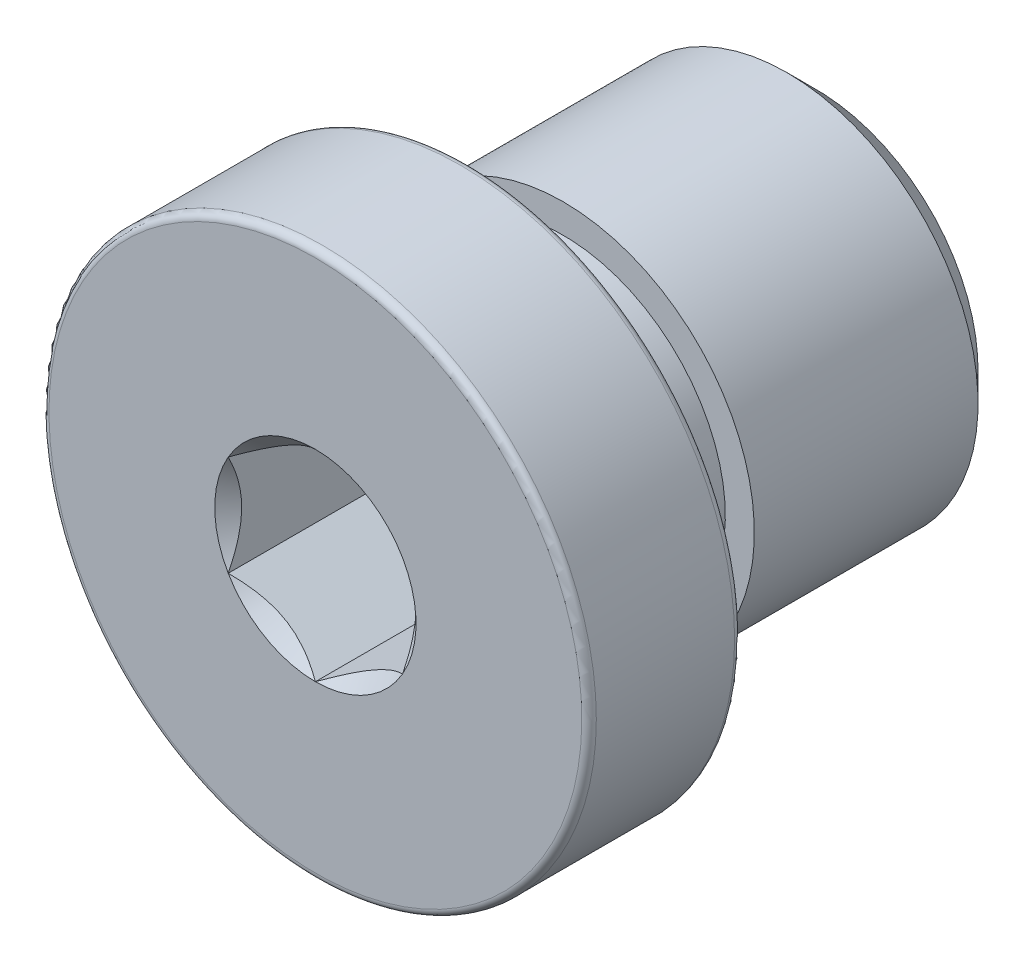
ISO-10303-21;
HEADER;
FILE_DESCRIPTION(('STEP AP214'),'2;1');
FILE_NAME('part.step','',(''),(''),'','','');
FILE_SCHEMA(('AUTOMOTIVE_DESIGN { 1 0 10303 214 1 1 1 1 }'));
ENDSEC;
DATA;
#1=APPLICATION_CONTEXT('core data for automotive mechanical design processes');
#2=APPLICATION_PROTOCOL_DEFINITION('international standard','automotive_design',2000,#1);
#3=PRODUCT_CONTEXT('',#1,'mechanical');
#4=PRODUCT('Part','Part','',(#3));
#5=PRODUCT_RELATED_PRODUCT_CATEGORY('part','',(#4));
#6=PRODUCT_DEFINITION_FORMATION('','',#4);
#7=PRODUCT_DEFINITION_CONTEXT('part definition',#1,'design');
#8=PRODUCT_DEFINITION('design','',#6,#7);
#9=PRODUCT_DEFINITION_SHAPE('','',#8);
#10=(LENGTH_UNIT() NAMED_UNIT(*) SI_UNIT(.MILLI.,.METRE.));
#11=(NAMED_UNIT(*) PLANE_ANGLE_UNIT() SI_UNIT($,.RADIAN.));
#12=(NAMED_UNIT(*) SI_UNIT($,.STERADIAN.) SOLID_ANGLE_UNIT());
#13=UNCERTAINTY_MEASURE_WITH_UNIT(LENGTH_MEASURE(1.E-05),#10,'distance_accuracy_value','');
#14=(GEOMETRIC_REPRESENTATION_CONTEXT(3) GLOBAL_UNCERTAINTY_ASSIGNED_CONTEXT((#13)) GLOBAL_UNIT_ASSIGNED_CONTEXT((#10,
#11,#12)) REPRESENTATION_CONTEXT('',''));
#15=CARTESIAN_POINT('',(0.,0.,0.));
#16=DIRECTION('',(0.,0.,1.));
#17=DIRECTION('',(1.,0.,0.));
#18=AXIS2_PLACEMENT_3D('',#15,#16,#17);
#19=CARTESIAN_POINT('',(0.,0.,0.));
#20=DIRECTION('',(0.,0.,-1.));
#21=DIRECTION('',(0.,1.,0.));
#22=AXIS2_PLACEMENT_3D('',#19,#20,#21);
#23=PLANE('',#22);
#24=CARTESIAN_POINT('',(0.,0.,0.));
#25=DIRECTION('',(0.,0.,-1.));
#26=DIRECTION('',(0.,1.,0.));
#27=AXIS2_PLACEMENT_3D('',#24,#25,#26);
#28=CIRCLE('',#27,9.17);
#29=CARTESIAN_POINT('',(0.,9.17,0.));
#30=VERTEX_POINT('',#29);
#31=EDGE_CURVE('E235',#30,#30,#28,.F.);
#32=ORIENTED_EDGE('',*,*,#31,.T.);
#33=EDGE_LOOP('',(#32));
#34=FACE_BOUND('',#33,.T.);
#35=CARTESIAN_POINT('',(0.,0.,0.));
#36=DIRECTION('',(0.,0.,1.));
#37=DIRECTION('',(1.,0.,0.));
#38=AXIS2_PLACEMENT_3D('',#35,#36,#37);
#39=CIRCLE('',#38,3.46410161513775);
#40=CARTESIAN_POINT('',(0.,3.46410161513776,0.));
#41=VERTEX_POINT('',#40);
#42=CARTESIAN_POINT('',(-3.,1.73205080756888,0.));
#43=VERTEX_POINT('',#42);
#44=EDGE_CURVE('E114',#41,#43,#39,.T.);
#45=ORIENTED_EDGE('',*,*,#44,.F.);
#46=CARTESIAN_POINT('',(3.,1.73205080756888,0.));
#47=VERTEX_POINT('',#46);
#48=EDGE_CURVE('E105',#47,#41,#39,.T.);
#49=ORIENTED_EDGE('',*,*,#48,.F.);
#50=CARTESIAN_POINT('',(3.,-1.73205080756888,0.));
#51=VERTEX_POINT('',#50);
#52=EDGE_CURVE('E116',#51,#47,#39,.T.);
#53=ORIENTED_EDGE('',*,*,#52,.F.);
#54=CARTESIAN_POINT('',(0.,-3.46410161513775,0.));
#55=VERTEX_POINT('',#54);
#56=EDGE_CURVE('E65',#55,#51,#39,.T.);
#57=ORIENTED_EDGE('',*,*,#56,.F.);
#58=CARTESIAN_POINT('',(-3.,-1.73205080756888,0.));
#59=VERTEX_POINT('',#58);
#60=EDGE_CURVE('E72',#59,#55,#39,.T.);
#61=ORIENTED_EDGE('',*,*,#60,.F.);
#62=EDGE_CURVE('E142',#43,#59,#39,.T.);
#63=ORIENTED_EDGE('',*,*,#62,.F.);
#64=EDGE_LOOP('',(#45,#49,#53,#57,#61,#63));
#65=FACE_BOUND('',#64,.T.);
#66=ADVANCED_FACE('F45',(#34,#65),#23,.F.);
#67=CARTESIAN_POINT('',(0.,0.,0.));
#68=DIRECTION('',(0.,0.,1.));
#69=DIRECTION('',(0.,-1.,0.));
#70=AXIS2_PLACEMENT_3D('',#67,#68,#69);
#71=CYLINDRICAL_SURFACE('',#70,9.42);
#72=CARTESIAN_POINT('',(0.,0.,-0.250000000000001));
#73=DIRECTION('',(0.,0.,-1.));
#74=DIRECTION('',(0.,1.,0.));
#75=AXIS2_PLACEMENT_3D('',#72,#73,#74);
#76=CIRCLE('',#75,9.42);
#77=CARTESIAN_POINT('',(0.,9.42,-0.249999999999999));
#78=VERTEX_POINT('',#77);
#79=EDGE_CURVE('E233',#78,#78,#76,.T.);
#80=ORIENTED_EDGE('',*,*,#79,.T.);
#81=EDGE_LOOP('',(#80));
#82=FACE_BOUND('',#81,.T.);
#83=CARTESIAN_POINT('',(0.,0.,-5.01));
#84=DIRECTION('',(0.,0.,1.));
#85=DIRECTION('',(0.,-1.,0.));
#86=AXIS2_PLACEMENT_3D('',#83,#84,#85);
#87=CIRCLE('',#86,9.42);
#88=CARTESIAN_POINT('',(0.,-9.42,-5.01));
#89=VERTEX_POINT('',#88);
#90=EDGE_CURVE('E236',#89,#89,#87,.T.);
#91=ORIENTED_EDGE('',*,*,#90,.T.);
#92=EDGE_LOOP('',(#91));
#93=FACE_BOUND('',#92,.T.);
#94=ADVANCED_FACE('F209',(#82,#93),#71,.T.);
#95=CARTESIAN_POINT('',(0.,9.42,-5.26));
#96=DIRECTION('',(0.,0.,1.));
#97=DIRECTION('',(0.,-1.,0.));
#98=AXIS2_PLACEMENT_3D('',#95,#96,#97);
#99=PLANE('',#98);
#100=CARTESIAN_POINT('',(0.,0.,-5.26));
#101=DIRECTION('',(0.,0.,1.));
#102=DIRECTION('',(0.,-1.,0.));
#103=AXIS2_PLACEMENT_3D('',#100,#101,#102);
#104=CIRCLE('',#103,9.17);
#105=CARTESIAN_POINT('',(0.,-9.17,-5.26));
#106=VERTEX_POINT('',#105);
#107=EDGE_CURVE('E59',#106,#106,#104,.F.);
#108=ORIENTED_EDGE('',*,*,#107,.T.);
#109=EDGE_LOOP('',(#108));
#110=FACE_BOUND('',#109,.T.);
#111=CARTESIAN_POINT('',(0.,0.,-5.26));
#112=DIRECTION('',(0.,0.,1.));
#113=DIRECTION('',(0.,-1.,0.));
#114=AXIS2_PLACEMENT_3D('',#111,#112,#113);
#115=CIRCLE('',#114,7.745);
#116=CARTESIAN_POINT('',(0.,-7.745,-5.26));
#117=VERTEX_POINT('',#116);
#118=EDGE_CURVE('E254',#117,#117,#115,.F.);
#119=ORIENTED_EDGE('',*,*,#118,.F.);
#120=EDGE_LOOP('',(#119));
#121=FACE_BOUND('',#120,.T.);
#122=ADVANCED_FACE('F215',(#110,#121),#99,.F.);
#123=CARTESIAN_POINT('',(0.,0.,-0.250000000000001));
#124=DIRECTION('',(0.,0.,-1.));
#125=DIRECTION('',(0.,1.,0.));
#126=AXIS2_PLACEMENT_3D('',#123,#124,#125);
#127=TOROIDAL_SURFACE('',#126,9.17,0.25);
#128=ORIENTED_EDGE('',*,*,#79,.F.);
#129=EDGE_LOOP('',(#128));
#130=FACE_BOUND('',#129,.T.);
#131=ORIENTED_EDGE('',*,*,#31,.F.);
#132=EDGE_LOOP('',(#131));
#133=FACE_BOUND('',#132,.T.);
#134=ADVANCED_FACE('F220',(#130,#133),#127,.T.);
#135=CARTESIAN_POINT('',(0.,0.,-5.01));
#136=DIRECTION('',(0.,0.,1.));
#137=DIRECTION('',(0.,-1.,0.));
#138=AXIS2_PLACEMENT_3D('',#135,#136,#137);
#139=TOROIDAL_SURFACE('',#138,9.17,0.25);
#140=ORIENTED_EDGE('',*,*,#107,.F.);
#141=EDGE_LOOP('',(#140));
#142=FACE_BOUND('',#141,.T.);
#143=ORIENTED_EDGE('',*,*,#90,.F.);
#144=EDGE_LOOP('',(#143));
#145=FACE_BOUND('',#144,.T.);
#146=ADVANCED_FACE('F47',(#142,#145),#139,.T.);
#147=CARTESIAN_POINT('',(0.,0.,-5.76000000000001));
#148=DIRECTION('',(0.,0.,1.));
#149=DIRECTION('',(0.,-1.,0.));
#150=AXIS2_PLACEMENT_3D('',#147,#148,#149);
#151=CYLINDRICAL_SURFACE('',#150,7.745);
#152=CARTESIAN_POINT('',(0.,0.,-5.76000000000001));
#153=DIRECTION('',(0.,0.,-1.));
#154=DIRECTION('',(0.,1.,0.));
#155=AXIS2_PLACEMENT_3D('',#152,#153,#154);
#156=CIRCLE('',#155,7.745);
#157=CARTESIAN_POINT('',(0.,7.745,-5.76));
#158=VERTEX_POINT('',#157);
#159=EDGE_CURVE('E257',#158,#158,#156,.T.);
#160=ORIENTED_EDGE('',*,*,#159,.F.);
#161=EDGE_LOOP('',(#160));
#162=FACE_BOUND('',#161,.T.);
#163=ORIENTED_EDGE('',*,*,#118,.T.);
#164=EDGE_LOOP('',(#163));
#165=FACE_BOUND('',#164,.T.);
#166=ADVANCED_FACE('F227',(#162,#165),#151,.T.);
#167=CARTESIAN_POINT('',(0.,0.,-5.76000000000001));
#168=DIRECTION('',(0.,0.,-1.));
#169=DIRECTION('',(0.,1.,0.));
#170=AXIS2_PLACEMENT_3D('',#167,#168,#169);
#171=PLANE('',#170);
#172=ORIENTED_EDGE('',*,*,#159,.T.);
#173=EDGE_LOOP('',(#172));
#174=FACE_BOUND('',#173,.T.);
#175=CARTESIAN_POINT('',(0.,0.,-5.76000000000001));
#176=DIRECTION('',(0.,0.,-1.));
#177=DIRECTION('',(0.,1.,0.));
#178=AXIS2_PLACEMENT_3D('',#175,#176,#177);
#179=CIRCLE('',#178,6.545);
#180=CARTESIAN_POINT('',(0.,6.545,-5.76));
#181=VERTEX_POINT('',#180);
#182=EDGE_CURVE('E261',#181,#181,#179,.T.);
#183=ORIENTED_EDGE('',*,*,#182,.F.);
#184=EDGE_LOOP('',(#183));
#185=FACE_BOUND('',#184,.T.);
#186=ADVANCED_FACE('F325',(#174,#185),#171,.T.);
#187=CARTESIAN_POINT('',(0.,0.,-5.76000000000001));
#188=DIRECTION('',(0.,0.,1.));
#189=DIRECTION('',(0.,-1.,0.));
#190=AXIS2_PLACEMENT_3D('',#187,#188,#189);
#191=CYLINDRICAL_SURFACE('',#190,6.545);
#192=ORIENTED_EDGE('',*,*,#182,.T.);
#193=EDGE_LOOP('',(#192));
#194=FACE_BOUND('',#193,.T.);
#195=CARTESIAN_POINT('',(0.,0.,-4.26000000000001));
#196=DIRECTION('',(0.,0.,-1.));
#197=DIRECTION('',(0.,1.,0.));
#198=AXIS2_PLACEMENT_3D('',#195,#196,#197);
#199=CIRCLE('',#198,6.545);
#200=CARTESIAN_POINT('',(0.,6.545,-4.26));
#201=VERTEX_POINT('',#200);
#202=EDGE_CURVE('E131',#201,#201,#199,.T.);
#203=ORIENTED_EDGE('',*,*,#202,.F.);
#204=EDGE_LOOP('',(#203));
#205=FACE_BOUND('',#204,.T.);
#206=ADVANCED_FACE('F164',(#194,#205),#191,.F.);
#207=CARTESIAN_POINT('',(0.,5.5785,-17.23));
#208=DIRECTION('',(0.,0.,1.));
#209=DIRECTION('',(0.,-1.,0.));
#210=AXIS2_PLACEMENT_3D('',#207,#208,#209);
#211=PLANE('',#210);
#212=CARTESIAN_POINT('',(0.,0.,-17.23));
#213=DIRECTION('',(0.,0.,1.));
#214=DIRECTION('',(0.,-1.,0.));
#215=AXIS2_PLACEMENT_3D('',#212,#213,#214);
#216=CIRCLE('',#215,5.57849999999999);
#217=CARTESIAN_POINT('',(0.,-5.57849999999999,-17.23));
#218=VERTEX_POINT('',#217);
#219=EDGE_CURVE('E278',#218,#218,#216,.T.);
#220=ORIENTED_EDGE('',*,*,#219,.F.);
#221=EDGE_LOOP('',(#220));
#222=FACE_BOUND('',#221,.T.);
#223=ADVANCED_FACE('F316',(#222),#211,.F.);
#224=CARTESIAN_POINT('',(0.,0.,-17.23));
#225=DIRECTION('',(0.,0.,1.));
#226=DIRECTION('',(0.,-1.,0.));
#227=AXIS2_PLACEMENT_3D('',#224,#225,#226);
#228=CONICAL_SURFACE('',#227,5.57849999999999,0.78539816339745);
#229=CARTESIAN_POINT('',(0.,0.,-16.23));
#230=DIRECTION('',(0.,0.,1.));
#231=DIRECTION('',(0.,-1.,0.));
#232=AXIS2_PLACEMENT_3D('',#229,#230,#231);
#233=CIRCLE('',#232,6.5785);
#234=CARTESIAN_POINT('',(0.,-6.5785,-16.23));
#235=VERTEX_POINT('',#234);
#236=EDGE_CURVE('E291',#235,#235,#233,.T.);
#237=ORIENTED_EDGE('',*,*,#236,.F.);
#238=EDGE_LOOP('',(#237));
#239=FACE_BOUND('',#238,.T.);
#240=ORIENTED_EDGE('',*,*,#219,.T.);
#241=EDGE_LOOP('',(#240));
#242=FACE_BOUND('',#241,.T.);
#243=ADVANCED_FACE('F310',(#239,#242),#228,.T.);
#244=CARTESIAN_POINT('',(0.,0.,0.));
#245=DIRECTION('',(0.,0.,1.));
#246=DIRECTION('',(0.,-1.,0.));
#247=AXIS2_PLACEMENT_3D('',#244,#245,#246);
#248=CYLINDRICAL_SURFACE('',#247,6.5785);
#249=CARTESIAN_POINT('',(0.,0.,-8.53));
#250=DIRECTION('',(0.,0.,1.));
#251=DIRECTION('',(0.,-1.,0.));
#252=AXIS2_PLACEMENT_3D('',#249,#250,#251);
#253=CIRCLE('',#252,6.5785);
#254=CARTESIAN_POINT('',(0.,-6.5785,-8.53));
#255=VERTEX_POINT('',#254);
#256=EDGE_CURVE('E294',#255,#255,#253,.T.);
#257=ORIENTED_EDGE('',*,*,#256,.F.);
#258=EDGE_LOOP('',(#257));
#259=FACE_BOUND('',#258,.T.);
#260=ORIENTED_EDGE('',*,*,#236,.T.);
#261=EDGE_LOOP('',(#260));
#262=FACE_BOUND('',#261,.T.);
#263=ADVANCED_FACE('F304',(#259,#262),#248,.T.);
#264=CARTESIAN_POINT('',(0.,5.58,-8.53));
#265=DIRECTION('',(0.,0.,-1.));
#266=DIRECTION('',(0.,1.,0.));
#267=AXIS2_PLACEMENT_3D('',#264,#265,#266);
#268=PLANE('',#267);
#269=CARTESIAN_POINT('',(0.,0.,-8.53));
#270=DIRECTION('',(0.,0.,1.));
#271=DIRECTION('',(0.,-1.,0.));
#272=AXIS2_PLACEMENT_3D('',#269,#270,#271);
#273=CIRCLE('',#272,5.58);
#274=CARTESIAN_POINT('',(0.,-5.58,-8.53));
#275=VERTEX_POINT('',#274);
#276=EDGE_CURVE('E242',#275,#275,#273,.T.);
#277=ORIENTED_EDGE('',*,*,#276,.F.);
#278=EDGE_LOOP('',(#277));
#279=FACE_BOUND('',#278,.T.);
#280=ORIENTED_EDGE('',*,*,#256,.T.);
#281=EDGE_LOOP('',(#280));
#282=FACE_BOUND('',#281,.T.);
#283=ADVANCED_FACE('F301',(#279,#282),#268,.F.);
#284=CARTESIAN_POINT('',(0.,0.,0.));
#285=DIRECTION('',(0.,0.,1.));
#286=DIRECTION('',(0.,-1.,0.));
#287=AXIS2_PLACEMENT_3D('',#284,#285,#286);
#288=CYLINDRICAL_SURFACE('',#287,5.58);
#289=CARTESIAN_POINT('',(0.,0.,-4.26000000000001));
#290=DIRECTION('',(0.,0.,1.));
#291=DIRECTION('',(0.,-1.,0.));
#292=AXIS2_PLACEMENT_3D('',#289,#290,#291);
#293=CIRCLE('',#292,5.58);
#294=CARTESIAN_POINT('',(0.,-5.58,-4.26000000000001));
#295=VERTEX_POINT('',#294);
#296=EDGE_CURVE('E237',#295,#295,#293,.T.);
#297=ORIENTED_EDGE('',*,*,#296,.F.);
#298=EDGE_LOOP('',(#297));
#299=FACE_BOUND('',#298,.T.);
#300=ORIENTED_EDGE('',*,*,#276,.T.);
#301=EDGE_LOOP('',(#300));
#302=FACE_BOUND('',#301,.T.);
#303=ADVANCED_FACE('F299',(#299,#302),#288,.T.);
#304=CARTESIAN_POINT('',(0.,7.745,-4.26));
#305=DIRECTION('',(0.,0.,1.));
#306=DIRECTION('',(0.,-1.,0.));
#307=AXIS2_PLACEMENT_3D('',#304,#305,#306);
#308=PLANE('',#307);
#309=ORIENTED_EDGE('',*,*,#202,.T.);
#310=EDGE_LOOP('',(#309));
#311=FACE_BOUND('',#310,.T.);
#312=ORIENTED_EDGE('',*,*,#296,.T.);
#313=EDGE_LOOP('',(#312));
#314=FACE_BOUND('',#313,.T.);
#315=ADVANCED_FACE('F331',(#311,#314),#308,.F.);
#316=CARTESIAN_POINT('',(0.,0.,-0.8));
#317=DIRECTION('',(0.,0.,1.));
#318=DIRECTION('',(1.,0.,0.));
#319=AXIS2_PLACEMENT_3D('',#316,#317,#318);
#320=CONICAL_SURFACE('',#319,2.66410161513775,0.78539816339745);
#321=CARTESIAN_POINT('',(-3.0002,1.73193533751504,0.000115475827149578));
#322=CARTESIAN_POINT('',(-2.89707648504425,1.79147372663452,-0.0593716816782131));
#323=CARTESIAN_POINT('',(-2.79222861066935,1.85200767512883,-0.11536502053448));
#324=CARTESIAN_POINT('',(-2.5784323282189,1.97544301635334,-0.217887403621058));
#325=CARTESIAN_POINT('',(-2.46946358862024,2.03835614749388,-0.264359406258708));
#326=CARTESIAN_POINT('',(-2.24973336040297,2.16521745390422,-0.343966811483701));
#327=CARTESIAN_POINT('',(-2.13902782823779,2.22913332270057,-0.377302299357331));
#328=CARTESIAN_POINT('',(-1.91517958943468,2.35837216363117,-0.428662456020693));
#329=CARTESIAN_POINT('',(-1.80204372079301,2.42369118784644,-0.446725462464396));
#330=CARTESIAN_POINT('',(-1.6070590438073,2.53626564359199,-0.463023091549501));
#331=CARTESIAN_POINT('',(-1.52546204599787,2.58337569224233,-0.465435632826191));
#332=CARTESIAN_POINT('',(-1.36240077116991,2.67751916315865,-0.461370565342885));
#333=CARTESIAN_POINT('',(-1.28093655070101,2.7245525527757,-0.454889839971692));
#334=CARTESIAN_POINT('',(-1.11877988766163,2.81817374583238,-0.433408277484775));
#335=CARTESIAN_POINT('',(-1.0380884112157,2.86476099147974,-0.418397910032719));
#336=CARTESIAN_POINT('',(-0.878091302108663,2.95713536549225,-0.380676353933985));
#337=CARTESIAN_POINT('',(-0.798785563690702,3.00292255491614,-0.357965755677167));
#338=CARTESIAN_POINT('',(-0.657993859197245,3.08420868340511,-0.311239315146056));
#339=CARTESIAN_POINT('',(-0.596196277853973,3.11988753362891,-0.2884516723192));
#340=CARTESIAN_POINT('',(-0.473710582479779,3.19060468282508,-0.239203713942553));
#341=CARTESIAN_POINT('',(-0.413022502364396,3.2256429622163,-0.212743286333803));
#342=CARTESIAN_POINT('',(-0.292947002609136,3.29496858432308,-0.156743005608639));
#343=CARTESIAN_POINT('',(-0.233556167704081,3.32925789884291,-0.12721283552163));
#344=CARTESIAN_POINT('',(-0.115874438532731,3.39720147685869,-0.0654609084244717));
#345=CARTESIAN_POINT('',(-0.0575828957522656,3.43085611477447,-0.0332408033406441));
#346=CARTESIAN_POINT('',(0.000199999999999896,3.46421708519159,0.000115475827149114));
#347=B_SPLINE_CURVE_WITH_KNOTS('',3,(#321,#322,#323,#324,#325,#326,#327,#328,#329,#330,#331,
#332,#333,#334,#335,#336,#337,#338,#339,#340,#341,#342,#343,#344,#345,#346),.UNSPECIFIED.,.F.,
.F.,(4,2,2,2,2,2,2,2,2,2,2,2,4),(0.,0.399603557139307,0.801535286397846,1.19708369162343,
1.59163620080173,1.87398941755844,2.15644160919093,2.43921001247425,2.72195674032138,
2.94657516661927,3.17120044767274,3.3951375283781,3.61893808380739),.UNSPECIFIED.);
#348=EDGE_CURVE('E11',#43,#41,#347,.T.);
#349=ORIENTED_EDGE('',*,*,#348,.T.);
#350=ORIENTED_EDGE('',*,*,#44,.T.);
#351=EDGE_LOOP('',(#349,#350));
#352=FACE_BOUND('',#351,.T.);
#353=ADVANCED_FACE('F120',(#352),#320,.F.);
#354=CARTESIAN_POINT('',(-3.,-3.48046506353163,1.13085617122593));
#355=CARTESIAN_POINT('',(-3.,-3.3958359623931,1.06676814425139));
#356=CARTESIAN_POINT('',(-3.,-3.31073595132609,1.00329189971776));
#357=CARTESIAN_POINT('',(-3.,-3.13940723096165,0.877837821343745));
#358=CARTESIAN_POINT('',(-3.,-3.05317824633077,0.815860363928996));
#359=CARTESIAN_POINT('',(-3.,-2.8787738715667,0.693237859074793));
#360=CARTESIAN_POINT('',(-3.,-2.7905885792116,0.632606847965694));
#361=CARTESIAN_POINT('',(-3.,-2.61272571380452,0.513581870901699));
#362=CARTESIAN_POINT('',(-3.,-2.52304824633921,0.455187747621506));
#363=CARTESIAN_POINT('',(-3.,-2.33668065297919,0.33781021238992));
#364=CARTESIAN_POINT('',(-3.,-2.23988655905179,0.278991039462196));
#365=CARTESIAN_POINT('',(-3.,-2.04406446620984,0.165202652967023));
#366=CARTESIAN_POINT('',(-3.,-1.94503676366883,0.110232932549631));
#367=CARTESIAN_POINT('',(-3.,-1.74470894022784,0.00530029604906012));
#368=CARTESIAN_POINT('',(-3.,-1.64341623171353,-0.0446766602587921));
#369=CARTESIAN_POINT('',(-3.,-1.43805120672712,-0.138495690235153));
#370=CARTESIAN_POINT('',(-3.,-1.33398018364556,-0.182340561251605));
#371=CARTESIAN_POINT('',(-3.,-1.1317116012942,-0.258986061999415));
#372=CARTESIAN_POINT('',(-3.,-1.03375021172157,-0.292403509679609));
#373=CARTESIAN_POINT('',(-3.,-0.835446147918717,-0.351382880110961));
#374=CARTESIAN_POINT('',(-3.,-0.735103312325473,-0.37694426890156));
#375=CARTESIAN_POINT('',(-3.,-0.534317077440579,-0.418443579978629));
#376=CARTESIAN_POINT('',(-3.,-0.433908660508412,-0.434547984317737));
#377=CARTESIAN_POINT('',(-3.,-0.231989694988445,-0.456816618381545));
#378=CARTESIAN_POINT('',(-3.,-0.130479345112608,-0.46298261128221));
#379=CARTESIAN_POINT('',(-3.,0.0688443816974967,-0.464905231534264));
#380=CARTESIAN_POINT('',(-3.,0.166654210715129,-0.461042099810735));
#381=CARTESIAN_POINT('',(-3.,0.361448715771726,-0.443964910869145));
#382=CARTESIAN_POINT('',(-3.,0.458433311527783,-0.430749954149789));
#383=CARTESIAN_POINT('',(-3.,0.65251559462825,-0.395469632275986));
#384=CARTESIAN_POINT('',(-3.,0.749585289746731,-0.37325274415393));
#385=CARTESIAN_POINT('',(-3.,0.941606316684515,-0.321161185452149));
#386=CARTESIAN_POINT('',(-3.,1.03655781606112,-0.291287122935554));
#387=CARTESIAN_POINT('',(-3.,1.23235946497188,-0.222251193160672));
#388=CARTESIAN_POINT('',(-3.,1.33300202597271,-0.182506604203623));
#389=CARTESIAN_POINT('',(-3.,1.53166462228954,-0.0969136545961863));
#390=CARTESIAN_POINT('',(-3.,1.62968377242467,-0.051063264170919));
#391=CARTESIAN_POINT('',(-3.,1.82359670086709,0.0456590306837532));
#392=CARTESIAN_POINT('',(-3.,1.91948239541606,0.0965470112287163));
#393=CARTESIAN_POINT('',(-3.,2.10904695147615,0.202216528688696));
#394=CARTESIAN_POINT('',(-3.,2.20272620491891,0.256997367061191));
#395=CARTESIAN_POINT('',(-3.,2.38356624494083,0.36688949879079));
#396=CARTESIAN_POINT('',(-3.,2.47081965818727,0.42184916881897));
#397=CARTESIAN_POINT('',(-3.,2.64382830701173,0.534085081138702));
#398=CARTESIAN_POINT('',(-3.,2.72958342860132,0.591361498596461));
#399=CARTESIAN_POINT('',(-3.,2.89909722275348,0.707345124700008));
#400=CARTESIAN_POINT('',(-3.,2.98286644388782,0.766036971534929));
#401=CARTESIAN_POINT('',(-3.,3.14925922117061,0.884976845590743));
#402=CARTESIAN_POINT('',(-3.,3.23188308620847,0.945224440182797));
#403=CARTESIAN_POINT('',(-3.,3.31402717485095,1.00610823627309));
#404=B_SPLINE_CURVE_WITH_KNOTS('',3,(#354,#355,#356,#357,#358,#359,#360,#361,#362,#363,#364,
#365,#366,#367,#368,#369,#370,#371,#372,#373,#374,#375,#376,#377,#378,#379,#380,#381,#382,#383,
#384,#385,#386,#387,#388,#389,#390,#391,#392,#393,#394,#395,#396,#397,#398,#399,#400,#401,#402,
#403),.UNSPECIFIED.,.F.,.F.,(4,2,2,2,2,2,2,2,2,2,2,2,2,2,2,2,2,2,2,2,2,2,2,2,4),(0.,
0.318477948436707,0.637035070029084,0.958059290874466,1.27906089176206,1.61878304489111,
1.95846038303202,2.29715390400962,2.63569241153745,2.94593370968279,3.25619608964582,
3.56081876359724,3.86538738841589,4.15857875805626,4.45179833201696,4.75017329891829,
5.0485245789311,5.37289082607017,5.69736517396251,6.02291059182161,6.34839773992787,
6.65771459594079,6.96705488286906,7.27388761253649,7.58063591671657),.UNSPECIFIED.);
#405=EDGE_CURVE('E113',#59,#43,#404,.T.);
#406=ORIENTED_EDGE('',*,*,#405,.T.);
#407=ORIENTED_EDGE('',*,*,#62,.T.);
#408=EDGE_LOOP('',(#406,#407));
#409=FACE_BOUND('',#408,.T.);
#410=ADVANCED_FACE('F338',(#409),#320,.F.);
#411=CARTESIAN_POINT('',(0.00020000000000392,-3.46421708519159,0.000115475827148253));
#412=CARTESIAN_POINT('',(-0.102923514955745,-3.40467869607211,-0.0593716816782142));
#413=CARTESIAN_POINT('',(-0.207771389330647,-3.3441447475778,-0.115365020534481));
#414=CARTESIAN_POINT('',(-0.421567671781093,-3.22070940635329,-0.217887403621059));
#415=CARTESIAN_POINT('',(-0.530536411379757,-3.15779627521275,-0.264359406258709));
#416=CARTESIAN_POINT('',(-0.750266639597027,-3.03093496880241,-0.343966811483703));
#417=CARTESIAN_POINT('',(-0.86097217176221,-2.96701910000606,-0.377302299357333));
#418=CARTESIAN_POINT('',(-1.08482041056532,-2.83778025907546,-0.428662456020695));
#419=CARTESIAN_POINT('',(-1.19795627920699,-2.77246123486019,-0.446725462464398));
#420=CARTESIAN_POINT('',(-1.3929409561927,-2.65988677911464,-0.463023091549503));
#421=CARTESIAN_POINT('',(-1.47453795400213,-2.6127767304643,-0.465435632826193));
#422=CARTESIAN_POINT('',(-1.63759922883009,-2.51863325954798,-0.461370565342887));
#423=CARTESIAN_POINT('',(-1.71906344929899,-2.47159986993094,-0.454889839971694));
#424=CARTESIAN_POINT('',(-1.88122011233837,-2.37797867687426,-0.433408277484777));
#425=CARTESIAN_POINT('',(-1.9619115887843,-2.33139143122689,-0.418397910032722));
#426=CARTESIAN_POINT('',(-2.12190869789134,-2.23901705721438,-0.380676353933987));
#427=CARTESIAN_POINT('',(-2.2012144363093,-2.19322986779049,-0.357965755677169));
#428=CARTESIAN_POINT('',(-2.34200614080275,-2.11194373930153,-0.311239315146058));
#429=CARTESIAN_POINT('',(-2.40380372214603,-2.07626488907772,-0.288451672319202));
#430=CARTESIAN_POINT('',(-2.52628941752022,-2.00554773988155,-0.239203713942555));
#431=CARTESIAN_POINT('',(-2.5869774976356,-1.97050946049033,-0.212743286333804));
#432=CARTESIAN_POINT('',(-2.70705299739086,-1.90118383838356,-0.15674300560864));
#433=CARTESIAN_POINT('',(-2.76644383229592,-1.86689452386373,-0.127212835521632));
#434=CARTESIAN_POINT('',(-2.88412556146727,-1.79895094584795,-0.0654609084244729));
#435=CARTESIAN_POINT('',(-2.94241710424773,-1.76529630793217,-0.0332408033406453));
#436=CARTESIAN_POINT('',(-3.0002,-1.73193533751504,0.000115475827147697));
#437=B_SPLINE_CURVE_WITH_KNOTS('',3,(#411,#412,#413,#414,#415,#416,#417,#418,#419,#420,#421,
#422,#423,#424,#425,#426,#427,#428,#429,#430,#431,#432,#433,#434,#435,#436),.UNSPECIFIED.,.F.,
.F.,(4,2,2,2,2,2,2,2,2,2,2,2,4),(0.,0.399603557139307,0.801535286397847,1.19708369162343,
1.59163620080173,1.87398941755845,2.15644160919093,2.43921001247426,2.72195674032138,
2.94657516661927,3.17120044767275,3.3951375283781,3.61893808380739),.UNSPECIFIED.);
#438=EDGE_CURVE('E150',#55,#59,#437,.T.);
#439=ORIENTED_EDGE('',*,*,#438,.T.);
#440=ORIENTED_EDGE('',*,*,#60,.T.);
#441=EDGE_LOOP('',(#439,#440));
#442=FACE_BOUND('',#441,.T.);
#443=ADVANCED_FACE('F408',(#442),#320,.F.);
#444=CARTESIAN_POINT('',(3.0002,-1.73193533751504,0.000115475827150522));
#445=CARTESIAN_POINT('',(2.89707648504425,-1.79147372663452,-0.0593716816782121));
#446=CARTESIAN_POINT('',(2.79222861066935,-1.85200767512883,-0.115365020534479));
#447=CARTESIAN_POINT('',(2.5784323282189,-1.97544301635334,-0.217887403621056));
#448=CARTESIAN_POINT('',(2.46946358862024,-2.03835614749388,-0.264359406258706));
#449=CARTESIAN_POINT('',(2.24973336040297,-2.16521745390422,-0.343966811483699));
#450=CARTESIAN_POINT('',(2.13902782823779,-2.22913332270057,-0.37730229935733));
#451=CARTESIAN_POINT('',(1.91517958943467,-2.35837216363117,-0.428662456020692));
#452=CARTESIAN_POINT('',(1.80204372079301,-2.42369118784644,-0.446725462464394));
#453=CARTESIAN_POINT('',(1.6070590438073,-2.53626564359199,-0.4630230915495));
#454=CARTESIAN_POINT('',(1.52546204599786,-2.58337569224233,-0.46543563282619));
#455=CARTESIAN_POINT('',(1.36240077116991,-2.67751916315866,-0.461370565342883));
#456=CARTESIAN_POINT('',(1.28093655070101,-2.7245525527757,-0.454889839971691));
#457=CARTESIAN_POINT('',(1.11877988766163,-2.81817374583238,-0.433408277484773));
#458=CARTESIAN_POINT('',(1.0380884112157,-2.86476099147974,-0.418397910032717));
#459=CARTESIAN_POINT('',(0.878091302108662,-2.95713536549225,-0.380676353933983));
#460=CARTESIAN_POINT('',(0.798785563690701,-3.00292255491614,-0.357965755677165));
#461=CARTESIAN_POINT('',(0.657993859197245,-3.08420868340511,-0.311239315146054));
#462=CARTESIAN_POINT('',(0.596196277853972,-3.11988753362891,-0.288451672319198));
#463=CARTESIAN_POINT('',(0.47371058247978,-3.19060468282508,-0.239203713942551));
#464=CARTESIAN_POINT('',(0.413022502364397,-3.2256429622163,-0.212743286333801));
#465=CARTESIAN_POINT('',(0.292947002609138,-3.29496858432308,-0.156743005608638));
#466=CARTESIAN_POINT('',(0.233556167704084,-3.32925789884291,-0.127212835521629));
#467=CARTESIAN_POINT('',(0.115874438532734,-3.39720147685869,-0.0654609084244714));
#468=CARTESIAN_POINT('',(0.0575828957522693,-3.43085611477447,-0.0332408033406443));
#469=CARTESIAN_POINT('',(-0.000199999999996096,-3.46421708519159,0.000115475827148709));
#470=B_SPLINE_CURVE_WITH_KNOTS('',3,(#444,#445,#446,#447,#448,#449,#450,#451,#452,#453,#454,
#455,#456,#457,#458,#459,#460,#461,#462,#463,#464,#465,#466,#467,#468,#469),.UNSPECIFIED.,.F.,
.F.,(4,2,2,2,2,2,2,2,2,2,2,2,4),(0.,0.399603557139307,0.801535286397846,1.19708369162343,
1.59163620080173,1.87398941755844,2.15644160919093,2.43921001247425,2.72195674032138,
2.94657516661927,3.17120044767274,3.3951375283781,3.61893808380738),.UNSPECIFIED.);
#471=EDGE_CURVE('E171',#51,#55,#470,.T.);
#472=ORIENTED_EDGE('',*,*,#471,.T.);
#473=ORIENTED_EDGE('',*,*,#56,.T.);
#474=EDGE_LOOP('',(#472,#473));
#475=FACE_BOUND('',#474,.T.);
#476=ADVANCED_FACE('F419',(#475),#320,.F.);
#477=CARTESIAN_POINT('',(3.,-3.4804650638163,1.13085617144155));
#478=CARTESIAN_POINT('',(3.,-3.39583596266974,1.0667681444587));
#479=CARTESIAN_POINT('',(3.,-3.31073595159468,1.00329189991677));
#480=CARTESIAN_POINT('',(3.,-3.13940723121405,0.877837821526202));
#481=CARTESIAN_POINT('',(3.,-3.05317824657504,0.815860364103201));
#482=CARTESIAN_POINT('',(3.,-2.87877387179443,0.693237859232435));
#483=CARTESIAN_POINT('',(3.,-2.79058857943092,0.632606848115029));
#484=CARTESIAN_POINT('',(3.,-2.61272571400688,0.51358187103455));
#485=CARTESIAN_POINT('',(3.,-2.52304824653301,0.455187747746182));
#486=CARTESIAN_POINT('',(3.,-2.33668065315452,0.337810212497577));
#487=CARTESIAN_POINT('',(3.,-2.23988655921719,0.278991039561042));
#488=CARTESIAN_POINT('',(3.,-2.04406446635503,0.165202653048663));
#489=CARTESIAN_POINT('',(3.,-1.94503676380375,0.110232932622876));
#490=CARTESIAN_POINT('',(3.,-1.74470894034183,0.00530029610620739));
#491=CARTESIAN_POINT('',(3.,-1.64341623181688,-0.0446766602093517));
#492=CARTESIAN_POINT('',(3.,-1.4380512068086,-0.138495690200155));
#493=CARTESIAN_POINT('',(3.,-1.33398018371582,-0.182340561223345));
#494=CARTESIAN_POINT('',(3.,-1.13171160135964,-0.258986061976117));
#495=CARTESIAN_POINT('',(3.,-1.03375021179391,-0.292403509655811));
#496=CARTESIAN_POINT('',(3.,-0.835446148005069,-0.35138288008756));
#497=CARTESIAN_POINT('',(3.,-0.735103312418949,-0.376944268879055));
#498=CARTESIAN_POINT('',(3.,-0.534317077548075,-0.418443579959535));
#499=CARTESIAN_POINT('',(3.,-0.433908660622798,-0.434547984301115));
#500=CARTESIAN_POINT('',(3.,-0.231989695116388,-0.456816618371435));
#501=CARTESIAN_POINT('',(3.,-0.130479345247219,-0.462982611276139));
#502=CARTESIAN_POINT('',(3.,0.0688443815507482,-0.464905231537443));
#503=CARTESIAN_POINT('',(3.,0.166654210562893,-0.461042099819031));
#504=CARTESIAN_POINT('',(3.,0.361448715609074,-0.443964910888458));
#505=CARTESIAN_POINT('',(3.,0.458433311360203,-0.430749954175003));
#506=CARTESIAN_POINT('',(3.,0.65251559445094,-0.395469632313563));
#507=CARTESIAN_POINT('',(3.,0.749585289564635,-0.373252744198005));
#508=CARTESIAN_POINT('',(3.,0.941606316493317,-0.321161185509346));
#509=CARTESIAN_POINT('',(3.,1.0365578158656,-0.291287122999374));
#510=CARTESIAN_POINT('',(3.,1.23235946475309,-0.222251193243378));
#511=CARTESIAN_POINT('',(3.,1.33300202573537,-0.182506604299667));
#512=CARTESIAN_POINT('',(3.,1.53166462201606,-0.096913654720233));
#513=CARTESIAN_POINT('',(3.,1.62968377213359,-0.0510632643096308));
#514=CARTESIAN_POINT('',(3.,1.82359670054144,0.0456590305148253));
#515=CARTESIAN_POINT('',(3.,1.91948239507346,0.0965470110442322));
#516=CARTESIAN_POINT('',(3.,2.10904695110017,0.202216528472617));
#517=CARTESIAN_POINT('',(3.,2.20272620452652,0.256997366829073));
#518=CARTESIAN_POINT('',(3.,2.38356624451862,0.366889498528213));
#519=CARTESIAN_POINT('',(3.,2.4708196577516,0.421849168542045));
#520=CARTESIAN_POINT('',(3.,2.64382830654932,0.534085080833018));
#521=CARTESIAN_POINT('',(3.,2.72958342812564,0.591361498276367));
#522=CARTESIAN_POINT('',(3.,2.89909722225158,0.707345124351258));
#523=CARTESIAN_POINT('',(3.,2.98286644337296,0.766036971171935));
#524=CARTESIAN_POINT('',(3.,3.14925922062993,0.884976845199277));
#525=CARTESIAN_POINT('',(3.,3.23188308565493,0.945224439777105));
#526=CARTESIAN_POINT('',(3.,3.31402717428456,1.00610823585319));
#527=B_SPLINE_CURVE_WITH_KNOTS('',3,(#477,#478,#479,#480,#481,#482,#483,#484,#485,#486,#487,
#488,#489,#490,#491,#492,#493,#494,#495,#496,#497,#498,#499,#500,#501,#502,#503,#504,#505,#506,
#507,#508,#509,#510,#511,#512,#513,#514,#515,#516,#517,#518,#519,#520,#521,#522,#523,#524,#525,
#526),.UNSPECIFIED.,.F.,.F.,(4,2,2,2,2,2,2,2,2,2,2,2,2,2,2,2,2,2,2,2,2,2,2,2,4),(0.,
0.318477948470958,0.637035070097594,0.958059290977881,1.27906089190038,1.6187830450686,
1.95846038324867,2.29715390426512,2.63569241183174,2.9459337099571,3.25619608990019,
3.56081876383249,3.86538738863203,4.15857875825541,4.4517983321991,4.7501732990821,
5.04852457907659,5.37289082614929,5.69736517397521,6.0229105917675,6.34839773980698,
6.65771459576278,6.96705488263392,7.27388761224501,7.58063591636874),.UNSPECIFIED.);
#528=EDGE_CURVE('E132',#47,#51,#527,.F.);
#529=ORIENTED_EDGE('',*,*,#528,.T.);
#530=ORIENTED_EDGE('',*,*,#52,.T.);
#531=EDGE_LOOP('',(#529,#530));
#532=FACE_BOUND('',#531,.T.);
#533=ADVANCED_FACE('F163',(#532),#320,.F.);
#534=CARTESIAN_POINT('',(-0.000199999999999981,3.46421708519159,0.000115475827148642));
#535=CARTESIAN_POINT('',(0.102923514955748,3.40467869607211,-0.0593716816782138));
#536=CARTESIAN_POINT('',(0.20777138933065,3.3441447475778,-0.11536502053448));
#537=CARTESIAN_POINT('',(0.421567671781096,3.2207094063533,-0.217887403621058));
#538=CARTESIAN_POINT('',(0.53053641137976,3.15779627521275,-0.264359406258708));
#539=CARTESIAN_POINT('',(0.750266639597029,3.03093496880241,-0.343966811483701));
#540=CARTESIAN_POINT('',(0.860972171762212,2.96701910000607,-0.377302299357332));
#541=CARTESIAN_POINT('',(1.08482041056533,2.83778025907546,-0.428662456020694));
#542=CARTESIAN_POINT('',(1.19795627920699,2.7724612348602,-0.446725462464396));
#543=CARTESIAN_POINT('',(1.3929409561927,2.65988677911464,-0.463023091549501));
#544=CARTESIAN_POINT('',(1.47453795400214,2.6127767304643,-0.465435632826191));
#545=CARTESIAN_POINT('',(1.63759922883009,2.51863325954798,-0.461370565342885));
#546=CARTESIAN_POINT('',(1.71906344929899,2.47159986993094,-0.454889839971692));
#547=CARTESIAN_POINT('',(1.88122011233837,2.37797867687426,-0.433408277484775));
#548=CARTESIAN_POINT('',(1.9619115887843,2.33139143122689,-0.41839791003272));
#549=CARTESIAN_POINT('',(2.12190869789134,2.23901705721438,-0.380676353933985));
#550=CARTESIAN_POINT('',(2.2012144363093,2.19322986779049,-0.357965755677167));
#551=CARTESIAN_POINT('',(2.34200614080276,2.11194373930153,-0.311239315146056));
#552=CARTESIAN_POINT('',(2.40380372214603,2.07626488907772,-0.2884516723192));
#553=CARTESIAN_POINT('',(2.52628941752022,2.00554773988155,-0.239203713942553));
#554=CARTESIAN_POINT('',(2.58697749763561,1.97050946049034,-0.212743286333802));
#555=CARTESIAN_POINT('',(2.70705299739086,1.90118383838356,-0.156743005608639));
#556=CARTESIAN_POINT('',(2.76644383229592,1.86689452386373,-0.12721283552163));
#557=CARTESIAN_POINT('',(2.88412556146727,1.79895094584795,-0.0654609084244715));
#558=CARTESIAN_POINT('',(2.94241710424774,1.76529630793217,-0.0332408033406438));
#559=CARTESIAN_POINT('',(3.0002,1.73193533751504,0.00011547582714942));
#560=B_SPLINE_CURVE_WITH_KNOTS('',3,(#534,#535,#536,#537,#538,#539,#540,#541,#542,#543,#544,
#545,#546,#547,#548,#549,#550,#551,#552,#553,#554,#555,#556,#557,#558,#559),.UNSPECIFIED.,.F.,
.F.,(4,2,2,2,2,2,2,2,2,2,2,2,4),(0.,0.399603557139306,0.801535286397846,1.19708369162343,
1.59163620080173,1.87398941755844,2.15644160919093,2.43921001247425,2.72195674032138,
2.94657516661927,3.17120044767274,3.3951375283781,3.61893808380739),.UNSPECIFIED.);
#561=EDGE_CURVE('E108',#41,#47,#560,.T.);
#562=ORIENTED_EDGE('',*,*,#561,.T.);
#563=ORIENTED_EDGE('',*,*,#48,.T.);
#564=EDGE_LOOP('',(#562,#563));
#565=FACE_BOUND('',#564,.T.);
#566=ADVANCED_FACE('F106',(#565),#320,.F.);
#567=CARTESIAN_POINT('',(0.,3.46410161513776,-8.));
#568=DIRECTION('',(0.,0.,1.));
#569=DIRECTION('',(1.,0.,0.));
#570=AXIS2_PLACEMENT_3D('',#567,#568,#569);
#571=PLANE('',#570);
#572=DIRECTION('',(-0.866025403784439,0.5,0.));
#573=VECTOR('',#572,1.);
#574=CARTESIAN_POINT('',(3.,1.73205080756888,-8.));
#575=LINE('',#574,#573);
#576=CARTESIAN_POINT('',(3.,1.73205080756888,-8.));
#577=VERTEX_POINT('',#576);
#578=CARTESIAN_POINT('',(0.,3.46410161513776,-8.));
#579=VERTEX_POINT('',#578);
#580=EDGE_CURVE('E256',#577,#579,#575,.T.);
#581=ORIENTED_EDGE('',*,*,#580,.T.);
#582=DIRECTION('',(-0.866025403784439,-0.5,0.));
#583=VECTOR('',#582,1.);
#584=CARTESIAN_POINT('',(0.,3.46410161513776,-8.));
#585=LINE('',#584,#583);
#586=CARTESIAN_POINT('',(-3.,1.73205080756888,-8.));
#587=VERTEX_POINT('',#586);
#588=EDGE_CURVE('E136',#579,#587,#585,.T.);
#589=ORIENTED_EDGE('',*,*,#588,.T.);
#590=DIRECTION('',(0.,-1.,0.));
#591=VECTOR('',#590,1.);
#592=CARTESIAN_POINT('',(-3.,1.73205080756888,-8.));
#593=LINE('',#592,#591);
#594=CARTESIAN_POINT('',(-3.,-1.73205080756888,-8.));
#595=VERTEX_POINT('',#594);
#596=EDGE_CURVE('E266',#587,#595,#593,.T.);
#597=ORIENTED_EDGE('',*,*,#596,.T.);
#598=DIRECTION('',(0.866025403784439,-0.5,0.));
#599=VECTOR('',#598,1.);
#600=CARTESIAN_POINT('',(-3.,-1.73205080756888,-8.));
#601=LINE('',#600,#599);
#602=CARTESIAN_POINT('',(0.,-3.46410161513776,-8.));
#603=VERTEX_POINT('',#602);
#604=EDGE_CURVE('E269',#595,#603,#601,.T.);
#605=ORIENTED_EDGE('',*,*,#604,.T.);
#606=DIRECTION('',(0.866025403784439,0.5,0.));
#607=VECTOR('',#606,1.);
#608=CARTESIAN_POINT('',(0.,-3.46410161513776,-8.));
#609=LINE('',#608,#607);
#610=CARTESIAN_POINT('',(3.,-1.73205080756888,-8.));
#611=VERTEX_POINT('',#610);
#612=EDGE_CURVE('E272',#603,#611,#609,.T.);
#613=ORIENTED_EDGE('',*,*,#612,.T.);
#614=DIRECTION('',(0.,1.,0.));
#615=VECTOR('',#614,1.);
#616=CARTESIAN_POINT('',(3.,-1.73205080756888,-8.));
#617=LINE('',#616,#615);
#618=EDGE_CURVE('E139',#611,#577,#617,.T.);
#619=ORIENTED_EDGE('',*,*,#618,.T.);
#620=EDGE_LOOP('',(#581,#589,#597,#605,#613,#619));
#621=FACE_BOUND('',#620,.T.);
#622=ADVANCED_FACE('F162',(#621),#571,.T.);
#623=CARTESIAN_POINT('',(0.,3.46410161513776,-8.));
#624=DIRECTION('',(-0.5,0.866025403784439,0.));
#625=DIRECTION('',(-0.866025403784439,-0.5,0.));
#626=AXIS2_PLACEMENT_3D('',#623,#624,#625);
#627=PLANE('',#626);
#628=ORIENTED_EDGE('',*,*,#348,.F.);
#629=DIRECTION('',(0.,0.,1.));
#630=VECTOR('',#629,1.);
#631=CARTESIAN_POINT('',(-3.,1.73205080756888,-8.));
#632=LINE('',#631,#630);
#633=EDGE_CURVE('E138',#587,#43,#632,.T.);
#634=ORIENTED_EDGE('',*,*,#633,.F.);
#635=ORIENTED_EDGE('',*,*,#588,.F.);
#636=DIRECTION('',(0.,0.,1.));
#637=VECTOR('',#636,1.);
#638=CARTESIAN_POINT('',(0.,3.46410161513776,-8.));
#639=LINE('',#638,#637);
#640=EDGE_CURVE('E127',#579,#41,#639,.T.);
#641=ORIENTED_EDGE('',*,*,#640,.T.);
#642=EDGE_LOOP('',(#628,#634,#635,#641));
#643=FACE_BOUND('',#642,.T.);
#644=ADVANCED_FACE('F134',(#643),#627,.F.);
#645=CARTESIAN_POINT('',(-3.,1.73205080756888,-8.));
#646=DIRECTION('',(-1.,0.,0.));
#647=DIRECTION('',(0.,-1.,0.));
#648=AXIS2_PLACEMENT_3D('',#645,#646,#647);
#649=PLANE('',#648);
#650=ORIENTED_EDGE('',*,*,#405,.F.);
#651=DIRECTION('',(0.,0.,1.));
#652=VECTOR('',#651,1.);
#653=CARTESIAN_POINT('',(-3.,-1.73205080756888,-8.));
#654=LINE('',#653,#652);
#655=EDGE_CURVE('E285',#595,#59,#654,.T.);
#656=ORIENTED_EDGE('',*,*,#655,.F.);
#657=ORIENTED_EDGE('',*,*,#596,.F.);
#658=ORIENTED_EDGE('',*,*,#633,.T.);
#659=EDGE_LOOP('',(#650,#656,#657,#658));
#660=FACE_BOUND('',#659,.T.);
#661=ADVANCED_FACE('F157',(#660),#649,.F.);
#662=CARTESIAN_POINT('',(-3.,-1.73205080756888,-8.));
#663=DIRECTION('',(-0.5,-0.866025403784439,0.));
#664=DIRECTION('',(0.866025403784439,-0.5,0.));
#665=AXIS2_PLACEMENT_3D('',#662,#663,#664);
#666=PLANE('',#665);
#667=ORIENTED_EDGE('',*,*,#438,.F.);
#668=DIRECTION('',(0.,0.,1.));
#669=VECTOR('',#668,1.);
#670=CARTESIAN_POINT('',(0.,-3.46410161513776,-8.));
#671=LINE('',#670,#669);
#672=EDGE_CURVE('E282',#603,#55,#671,.T.);
#673=ORIENTED_EDGE('',*,*,#672,.F.);
#674=ORIENTED_EDGE('',*,*,#604,.F.);
#675=ORIENTED_EDGE('',*,*,#655,.T.);
#676=EDGE_LOOP('',(#667,#673,#674,#675));
#677=FACE_BOUND('',#676,.T.);
#678=ADVANCED_FACE('F198',(#677),#666,.F.);
#679=CARTESIAN_POINT('',(0.,-3.46410161513776,-8.));
#680=DIRECTION('',(0.5,-0.866025403784439,0.));
#681=DIRECTION('',(0.866025403784439,0.5,0.));
#682=AXIS2_PLACEMENT_3D('',#679,#680,#681);
#683=PLANE('',#682);
#684=ORIENTED_EDGE('',*,*,#471,.F.);
#685=DIRECTION('',(0.,0.,1.));
#686=VECTOR('',#685,1.);
#687=CARTESIAN_POINT('',(3.,-1.73205080756888,-8.));
#688=LINE('',#687,#686);
#689=EDGE_CURVE('E279',#611,#51,#688,.T.);
#690=ORIENTED_EDGE('',*,*,#689,.F.);
#691=ORIENTED_EDGE('',*,*,#612,.F.);
#692=ORIENTED_EDGE('',*,*,#672,.T.);
#693=EDGE_LOOP('',(#684,#690,#691,#692));
#694=FACE_BOUND('',#693,.T.);
#695=ADVANCED_FACE('F193',(#694),#683,.F.);
#696=CARTESIAN_POINT('',(3.,-1.73205080756888,-8.));
#697=DIRECTION('',(1.,0.,0.));
#698=DIRECTION('',(0.,1.,0.));
#699=AXIS2_PLACEMENT_3D('',#696,#697,#698);
#700=PLANE('',#699);
#701=ORIENTED_EDGE('',*,*,#528,.F.);
#702=DIRECTION('',(0.,0.,1.));
#703=VECTOR('',#702,1.);
#704=CARTESIAN_POINT('',(3.,1.73205080756888,-8.));
#705=LINE('',#704,#703);
#706=EDGE_CURVE('E129',#577,#47,#705,.T.);
#707=ORIENTED_EDGE('',*,*,#706,.F.);
#708=ORIENTED_EDGE('',*,*,#618,.F.);
#709=ORIENTED_EDGE('',*,*,#689,.T.);
#710=EDGE_LOOP('',(#701,#707,#708,#709));
#711=FACE_BOUND('',#710,.T.);
#712=ADVANCED_FACE('F189',(#711),#700,.F.);
#713=CARTESIAN_POINT('',(3.,1.73205080756888,-8.));
#714=DIRECTION('',(0.5,0.866025403784439,0.));
#715=DIRECTION('',(-0.866025403784439,0.5,0.));
#716=AXIS2_PLACEMENT_3D('',#713,#714,#715);
#717=PLANE('',#716);
#718=ORIENTED_EDGE('',*,*,#561,.F.);
#719=ORIENTED_EDGE('',*,*,#640,.F.);
#720=ORIENTED_EDGE('',*,*,#580,.F.);
#721=ORIENTED_EDGE('',*,*,#706,.T.);
#722=EDGE_LOOP('',(#718,#719,#720,#721));
#723=FACE_BOUND('',#722,.T.);
#724=ADVANCED_FACE('F125',(#723),#717,.F.);
#725=CLOSED_SHELL('',(#66,#94,#122,#134,#146,#166,#186,#206,#223,#243,#263,#283,#303,#315,#353,
#410,#443,#476,#533,#566,#622,#644,#661,#678,#695,#712,#724));
#726=MANIFOLD_SOLID_BREP('B2',#725);
#727=ADVANCED_BREP_SHAPE_REPRESENTATION('',(#18,#726),#14);
#728=SHAPE_DEFINITION_REPRESENTATION(#9,#727);
ENDSEC;
END-ISO-10303-21;
